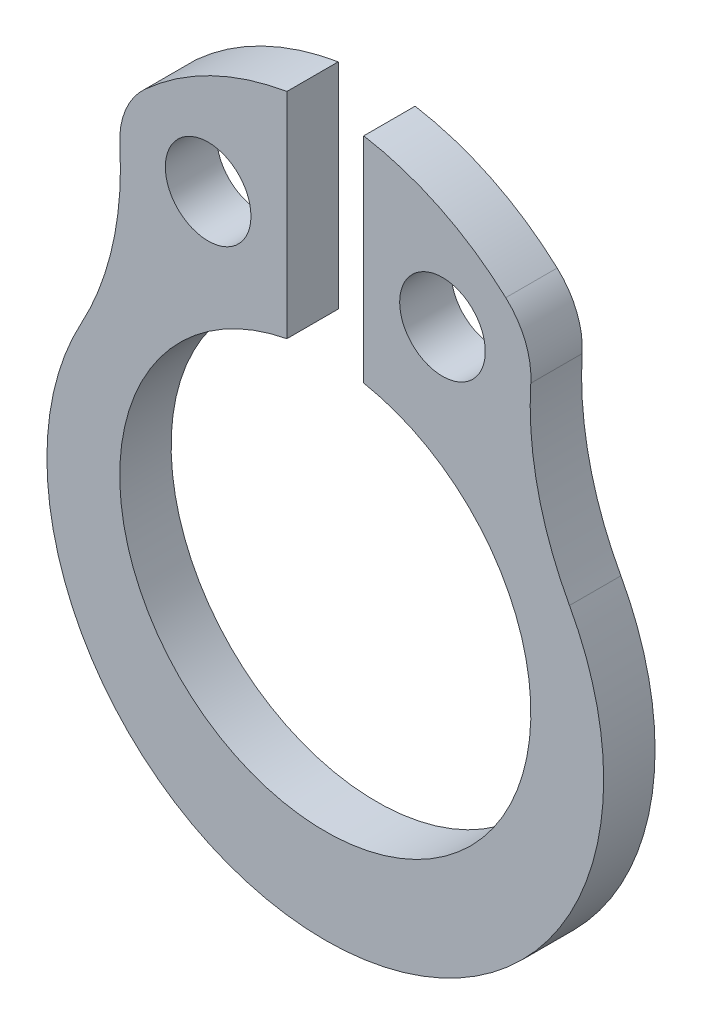
ISO-10303-21;
HEADER;
FILE_DESCRIPTION(('STEP AP214'),'2;1');
FILE_NAME('part.step','',(''),(''),'','','');
FILE_SCHEMA(('AUTOMOTIVE_DESIGN { 1 0 10303 214 1 1 1 1 }'));
ENDSEC;
DATA;
#1=APPLICATION_CONTEXT('core data for automotive mechanical design processes');
#2=APPLICATION_PROTOCOL_DEFINITION('international standard','automotive_design',2000,#1);
#3=PRODUCT_CONTEXT('',#1,'mechanical');
#4=PRODUCT('Part','Part','',(#3));
#5=PRODUCT_RELATED_PRODUCT_CATEGORY('part','',(#4));
#6=PRODUCT_DEFINITION_FORMATION('','',#4);
#7=PRODUCT_DEFINITION_CONTEXT('part definition',#1,'design');
#8=PRODUCT_DEFINITION('design','',#6,#7);
#9=PRODUCT_DEFINITION_SHAPE('','',#8);
#10=(LENGTH_UNIT() NAMED_UNIT(*) SI_UNIT(.MILLI.,.METRE.));
#11=(NAMED_UNIT(*) PLANE_ANGLE_UNIT() SI_UNIT($,.RADIAN.));
#12=(NAMED_UNIT(*) SI_UNIT($,.STERADIAN.) SOLID_ANGLE_UNIT());
#13=UNCERTAINTY_MEASURE_WITH_UNIT(LENGTH_MEASURE(1.E-05),#10,'distance_accuracy_value','');
#14=(GEOMETRIC_REPRESENTATION_CONTEXT(3) GLOBAL_UNCERTAINTY_ASSIGNED_CONTEXT((#13)) GLOBAL_UNIT_ASSIGNED_CONTEXT((#10,
#11,#12)) REPRESENTATION_CONTEXT('',''));
#15=CARTESIAN_POINT('',(0.,0.,0.));
#16=DIRECTION('',(0.,0.,1.));
#17=DIRECTION('',(1.,0.,0.));
#18=AXIS2_PLACEMENT_3D('',#15,#16,#17);
#19=CARTESIAN_POINT('',(-0.0930318965361677,1.63724435281842,0.3));
#20=DIRECTION('',(0.,0.,-1.));
#21=DIRECTION('',(-1.,0.,0.));
#22=AXIS2_PLACEMENT_3D('',#19,#20,#21);
#23=PLANE('',#22);
#24=CARTESIAN_POINT('',(-0.0930318965361677,1.63724435281842,0.3));
#25=DIRECTION('',(0.,0.,1.));
#26=DIRECTION('',(-1.,0.,0.));
#27=AXIS2_PLACEMENT_3D('',#24,#25,#26);
#28=CIRCLE('',#27,3.26568603204113);
#29=CARTESIAN_POINT('',(2.10700125912853,4.05065674481539,0.3));
#30=VERTEX_POINT('',#29);
#31=CARTESIAN_POINT('',(0.448644837297062,4.85769332398569,0.3));
#32=VERTEX_POINT('',#31);
#33=EDGE_CURVE('E163',#30,#32,#28,.T.);
#34=ORIENTED_EDGE('',*,*,#33,.T.);
#35=DIRECTION('',(0.,-1.,0.));
#36=VECTOR('',#35,1.);
#37=CARTESIAN_POINT('',(0.448644837297062,4.85769332398569,0.3));
#38=LINE('',#37,#36);
#39=CARTESIAN_POINT('',(0.448644837297062,2.35769332398569,0.3));
#40=VERTEX_POINT('',#39);
#41=EDGE_CURVE('E101',#32,#40,#38,.T.);
#42=ORIENTED_EDGE('',*,*,#41,.T.);
#43=CARTESIAN_POINT('',(0.,0.,0.3));
#44=DIRECTION('',(0.,0.,-1.));
#45=DIRECTION('',(1.,0.,0.));
#46=AXIS2_PLACEMENT_3D('',#43,#44,#45);
#47=CIRCLE('',#46,2.4);
#48=CARTESIAN_POINT('',(-0.448644837297062,2.35769332398569,0.3));
#49=VERTEX_POINT('',#48);
#50=EDGE_CURVE('E184',#40,#49,#47,.T.);
#51=ORIENTED_EDGE('',*,*,#50,.T.);
#52=DIRECTION('',(0.,1.,0.));
#53=VECTOR('',#52,1.);
#54=CARTESIAN_POINT('',(-0.448644837297062,4.85769332398569,0.3));
#55=LINE('',#54,#53);
#56=CARTESIAN_POINT('',(-0.448644837297062,4.85769332398569,0.3));
#57=VERTEX_POINT('',#56);
#58=EDGE_CURVE('E203',#49,#57,#55,.T.);
#59=ORIENTED_EDGE('',*,*,#58,.T.);
#60=CARTESIAN_POINT('',(0.0930318965361562,1.63724435281842,0.3));
#61=DIRECTION('',(0.,0.,1.));
#62=DIRECTION('',(1.,0.,0.));
#63=AXIS2_PLACEMENT_3D('',#60,#61,#62);
#64=CIRCLE('',#63,3.26568603204113);
#65=CARTESIAN_POINT('',(-2.10700125912855,4.05065674481539,0.3));
#66=VERTEX_POINT('',#65);
#67=EDGE_CURVE('E200',#57,#66,#64,.T.);
#68=ORIENTED_EDGE('',*,*,#67,.T.);
#69=CARTESIAN_POINT('',(-1.50111205714647,3.38600289425138,0.3));
#70=DIRECTION('',(0.,0.,1.));
#71=DIRECTION('',(1.,0.,0.));
#72=AXIS2_PLACEMENT_3D('',#69,#70,#71);
#73=CIRCLE('',#72,0.899370038498089);
#74=CARTESIAN_POINT('',(-2.39882437798507,3.33142217272238,0.3));
#75=VERTEX_POINT('',#74);
#76=EDGE_CURVE('E202',#66,#75,#73,.T.);
#77=ORIENTED_EDGE('',*,*,#76,.T.);
#78=CARTESIAN_POINT('',(-6.12858680478431,3.10465339648909,0.3));
#79=DIRECTION('',(0.,0.,-1.));
#80=DIRECTION('',(-1.,0.,0.));
#81=AXIS2_PLACEMENT_3D('',#78,#79,#80);
#82=CIRCLE('',#81,3.73664981477566);
#83=CARTESIAN_POINT('',(-2.85085236038413,1.31049377419914,0.3));
#84=VERTEX_POINT('',#83);
#85=EDGE_CURVE('E126',#75,#84,#82,.T.);
#86=ORIENTED_EDGE('',*,*,#85,.T.);
#87=CARTESIAN_POINT('',(0.,-0.25,0.3));
#88=DIRECTION('',(0.,0.,1.));
#89=DIRECTION('',(1.,0.,0.));
#90=AXIS2_PLACEMENT_3D('',#87,#88,#89);
#91=CIRCLE('',#90,3.25000000000306);
#92=CARTESIAN_POINT('',(2.85085236038545,1.31049377419605,0.3));
#93=VERTEX_POINT('',#92);
#94=EDGE_CURVE('E120',#84,#93,#91,.T.);
#95=ORIENTED_EDGE('',*,*,#94,.T.);
#96=CARTESIAN_POINT('',(6.12858680478428,3.10465339648909,0.3));
#97=DIRECTION('',(0.,0.,-1.));
#98=DIRECTION('',(1.,0.,0.));
#99=AXIS2_PLACEMENT_3D('',#96,#97,#98);
#100=CIRCLE('',#99,3.73664981477259);
#101=CARTESIAN_POINT('',(2.39882437798473,3.3314221727224,0.3));
#102=VERTEX_POINT('',#101);
#103=EDGE_CURVE('E124',#93,#102,#100,.T.);
#104=ORIENTED_EDGE('',*,*,#103,.T.);
#105=CARTESIAN_POINT('',(1.50111205714645,3.38600289425138,0.3));
#106=DIRECTION('',(0.,0.,1.));
#107=DIRECTION('',(-1.,0.,0.));
#108=AXIS2_PLACEMENT_3D('',#105,#106,#107);
#109=CIRCLE('',#108,0.899370038498088);
#110=EDGE_CURVE('E52',#102,#30,#109,.T.);
#111=ORIENTED_EDGE('',*,*,#110,.T.);
#112=EDGE_LOOP('',(#34,#42,#51,#59,#68,#77,#86,#95,#104,#111));
#113=FACE_BOUND('',#112,.T.);
#114=CARTESIAN_POINT('',(-1.36799975514841,3.38600289425138,0.3));
#115=DIRECTION('',(0.,0.,1.));
#116=DIRECTION('',(1.,0.,0.));
#117=AXIS2_PLACEMENT_3D('',#114,#115,#116);
#118=CIRCLE('',#117,0.5);
#119=CARTESIAN_POINT('',(-0.867999755148409,3.38600289425138,0.3));
#120=VERTEX_POINT('',#119);
#121=EDGE_CURVE('E148',#120,#120,#118,.T.);
#122=ORIENTED_EDGE('',*,*,#121,.F.);
#123=EDGE_LOOP('',(#122));
#124=FACE_BOUND('',#123,.T.);
#125=CARTESIAN_POINT('',(1.36799975515539,3.38600289425138,0.3));
#126=DIRECTION('',(0.,0.,1.));
#127=DIRECTION('',(-1.,0.,0.));
#128=AXIS2_PLACEMENT_3D('',#125,#126,#127);
#129=CIRCLE('',#128,0.5);
#130=CARTESIAN_POINT('',(0.867999755155392,3.38600289425138,0.3));
#131=VERTEX_POINT('',#130);
#132=EDGE_CURVE('E214',#131,#131,#129,.T.);
#133=ORIENTED_EDGE('',*,*,#132,.F.);
#134=EDGE_LOOP('',(#133));
#135=FACE_BOUND('',#134,.T.);
#136=ADVANCED_FACE('F35',(#113,#124,#135),#23,.F.);
#137=CARTESIAN_POINT('',(-0.0930318965361677,1.63724435281842,-0.3));
#138=DIRECTION('',(0.,0.,-1.));
#139=DIRECTION('',(-1.,0.,0.));
#140=AXIS2_PLACEMENT_3D('',#137,#138,#139);
#141=PLANE('',#140);
#142=CARTESIAN_POINT('',(-1.36799975514841,3.38600289425138,-0.3));
#143=DIRECTION('',(0.,0.,1.));
#144=DIRECTION('',(1.,0.,0.));
#145=AXIS2_PLACEMENT_3D('',#142,#143,#144);
#146=CIRCLE('',#145,0.5);
#147=CARTESIAN_POINT('',(-0.867999755148409,3.38600289425138,-0.3));
#148=VERTEX_POINT('',#147);
#149=EDGE_CURVE('E211',#148,#148,#146,.T.);
#150=ORIENTED_EDGE('',*,*,#149,.T.);
#151=EDGE_LOOP('',(#150));
#152=FACE_BOUND('',#151,.T.);
#153=CARTESIAN_POINT('',(-0.0930318965361677,1.63724435281842,-0.3));
#154=DIRECTION('',(0.,0.,1.));
#155=DIRECTION('',(-1.,0.,0.));
#156=AXIS2_PLACEMENT_3D('',#153,#154,#155);
#157=CIRCLE('',#156,3.26568603204113);
#158=CARTESIAN_POINT('',(2.10700125912853,4.05065674481539,-0.3));
#159=VERTEX_POINT('',#158);
#160=CARTESIAN_POINT('',(0.448644837297062,4.85769332398569,-0.3));
#161=VERTEX_POINT('',#160);
#162=EDGE_CURVE('E144',#159,#161,#157,.T.);
#163=ORIENTED_EDGE('',*,*,#162,.F.);
#164=CARTESIAN_POINT('',(1.50111205714645,3.38600289425138,-0.3));
#165=DIRECTION('',(0.,0.,1.));
#166=DIRECTION('',(-1.,0.,0.));
#167=AXIS2_PLACEMENT_3D('',#164,#165,#166);
#168=CIRCLE('',#167,0.899370038498088);
#169=CARTESIAN_POINT('',(2.39882437798473,3.3314221727224,-0.3));
#170=VERTEX_POINT('',#169);
#171=EDGE_CURVE('E93',#170,#159,#168,.T.);
#172=ORIENTED_EDGE('',*,*,#171,.F.);
#173=CARTESIAN_POINT('',(6.12858680478428,3.10465339648909,-0.3));
#174=DIRECTION('',(0.,0.,-1.));
#175=DIRECTION('',(1.,0.,0.));
#176=AXIS2_PLACEMENT_3D('',#173,#174,#175);
#177=CIRCLE('',#176,3.73664981477259);
#178=CARTESIAN_POINT('',(2.85085236038545,1.31049377419605,-0.3));
#179=VERTEX_POINT('',#178);
#180=EDGE_CURVE('E87',#179,#170,#177,.T.);
#181=ORIENTED_EDGE('',*,*,#180,.F.);
#182=CARTESIAN_POINT('',(0.,-0.25,-0.3));
#183=DIRECTION('',(0.,0.,1.));
#184=DIRECTION('',(1.,0.,0.));
#185=AXIS2_PLACEMENT_3D('',#182,#183,#184);
#186=CIRCLE('',#185,3.25000000000306);
#187=CARTESIAN_POINT('',(-2.85085236038413,1.31049377419914,-0.3));
#188=VERTEX_POINT('',#187);
#189=EDGE_CURVE('E134',#188,#179,#186,.T.);
#190=ORIENTED_EDGE('',*,*,#189,.F.);
#191=CARTESIAN_POINT('',(-6.12858680478431,3.10465339648909,-0.3));
#192=DIRECTION('',(0.,0.,-1.));
#193=DIRECTION('',(-1.,0.,0.));
#194=AXIS2_PLACEMENT_3D('',#191,#192,#193);
#195=CIRCLE('',#194,3.73664981477566);
#196=CARTESIAN_POINT('',(-2.39882437798507,3.33142217272238,-0.3));
#197=VERTEX_POINT('',#196);
#198=EDGE_CURVE('E158',#197,#188,#195,.T.);
#199=ORIENTED_EDGE('',*,*,#198,.F.);
#200=CARTESIAN_POINT('',(-1.50111205714647,3.38600289425138,-0.3));
#201=DIRECTION('',(0.,0.,1.));
#202=DIRECTION('',(1.,0.,0.));
#203=AXIS2_PLACEMENT_3D('',#200,#201,#202);
#204=CIRCLE('',#203,0.899370038498089);
#205=CARTESIAN_POINT('',(-2.10700125912855,4.05065674481539,-0.3));
#206=VERTEX_POINT('',#205);
#207=EDGE_CURVE('E156',#206,#197,#204,.T.);
#208=ORIENTED_EDGE('',*,*,#207,.F.);
#209=CARTESIAN_POINT('',(0.0930318965361562,1.63724435281842,-0.3));
#210=DIRECTION('',(0.,0.,1.));
#211=DIRECTION('',(1.,0.,0.));
#212=AXIS2_PLACEMENT_3D('',#209,#210,#211);
#213=CIRCLE('',#212,3.26568603204113);
#214=CARTESIAN_POINT('',(-0.448644837297062,4.85769332398569,-0.3));
#215=VERTEX_POINT('',#214);
#216=EDGE_CURVE('E154',#215,#206,#213,.T.);
#217=ORIENTED_EDGE('',*,*,#216,.F.);
#218=DIRECTION('',(0.,1.,0.));
#219=VECTOR('',#218,1.);
#220=CARTESIAN_POINT('',(-0.448644837297062,4.85769332398569,-0.3));
#221=LINE('',#220,#219);
#222=CARTESIAN_POINT('',(-0.448644837297062,2.35769332398569,-0.3));
#223=VERTEX_POINT('',#222);
#224=EDGE_CURVE('E152',#223,#215,#221,.T.);
#225=ORIENTED_EDGE('',*,*,#224,.F.);
#226=CARTESIAN_POINT('',(0.,0.,-0.3));
#227=DIRECTION('',(0.,0.,-1.));
#228=DIRECTION('',(1.,0.,0.));
#229=AXIS2_PLACEMENT_3D('',#226,#227,#228);
#230=CIRCLE('',#229,2.4);
#231=CARTESIAN_POINT('',(0.448644837297062,2.35769332398569,-0.3));
#232=VERTEX_POINT('',#231);
#233=EDGE_CURVE('E150',#232,#223,#230,.T.);
#234=ORIENTED_EDGE('',*,*,#233,.F.);
#235=DIRECTION('',(0.,-1.,0.));
#236=VECTOR('',#235,1.);
#237=CARTESIAN_POINT('',(0.448644837297062,4.85769332398569,-0.3));
#238=LINE('',#237,#236);
#239=EDGE_CURVE('E147',#161,#232,#238,.T.);
#240=ORIENTED_EDGE('',*,*,#239,.F.);
#241=EDGE_LOOP('',(#163,#172,#181,#190,#199,#208,#217,#225,#234,#240));
#242=FACE_BOUND('',#241,.T.);
#243=CARTESIAN_POINT('',(1.36799975515539,3.38600289425138,-0.3));
#244=DIRECTION('',(0.,0.,1.));
#245=DIRECTION('',(-1.,0.,0.));
#246=AXIS2_PLACEMENT_3D('',#243,#244,#245);
#247=CIRCLE('',#246,0.5);
#248=CARTESIAN_POINT('',(0.867999755155392,3.38600289425138,-0.3));
#249=VERTEX_POINT('',#248);
#250=EDGE_CURVE('E217',#249,#249,#247,.T.);
#251=ORIENTED_EDGE('',*,*,#250,.T.);
#252=EDGE_LOOP('',(#251));
#253=FACE_BOUND('',#252,.T.);
#254=ADVANCED_FACE('F188',(#152,#242,#253),#141,.T.);
#255=CARTESIAN_POINT('',(-0.0930318965361677,1.63724435281842,0.3));
#256=DIRECTION('',(0.,0.,-1.));
#257=DIRECTION('',(-1.,0.,0.));
#258=AXIS2_PLACEMENT_3D('',#255,#256,#257);
#259=CYLINDRICAL_SURFACE('',#258,3.26568603204113);
#260=ORIENTED_EDGE('',*,*,#162,.T.);
#261=DIRECTION('',(0.,0.,-1.));
#262=VECTOR('',#261,1.);
#263=CARTESIAN_POINT('',(0.448644837297062,4.85769332398569,0.3));
#264=LINE('',#263,#262);
#265=EDGE_CURVE('E11',#32,#161,#264,.T.);
#266=ORIENTED_EDGE('',*,*,#265,.F.);
#267=ORIENTED_EDGE('',*,*,#33,.F.);
#268=DIRECTION('',(0.,0.,-1.));
#269=VECTOR('',#268,1.);
#270=CARTESIAN_POINT('',(2.10700125912853,4.05065674481539,0.3));
#271=LINE('',#270,#269);
#272=EDGE_CURVE('E140',#30,#159,#271,.T.);
#273=ORIENTED_EDGE('',*,*,#272,.T.);
#274=EDGE_LOOP('',(#260,#266,#267,#273));
#275=FACE_BOUND('',#274,.T.);
#276=ADVANCED_FACE('F37',(#275),#259,.T.);
#277=CARTESIAN_POINT('',(0.448644837297062,4.85769332398569,0.3));
#278=DIRECTION('',(1.,0.,0.));
#279=DIRECTION('',(0.,1.,0.));
#280=AXIS2_PLACEMENT_3D('',#277,#278,#279);
#281=PLANE('',#280);
#282=ORIENTED_EDGE('',*,*,#239,.T.);
#283=DIRECTION('',(0.,0.,-1.));
#284=VECTOR('',#283,1.);
#285=CARTESIAN_POINT('',(0.448644837297062,2.35769332398569,0.3));
#286=LINE('',#285,#284);
#287=EDGE_CURVE('E44',#40,#232,#286,.T.);
#288=ORIENTED_EDGE('',*,*,#287,.F.);
#289=ORIENTED_EDGE('',*,*,#41,.F.);
#290=ORIENTED_EDGE('',*,*,#265,.T.);
#291=EDGE_LOOP('',(#282,#288,#289,#290));
#292=FACE_BOUND('',#291,.T.);
#293=ADVANCED_FACE('F257',(#292),#281,.F.);
#294=CARTESIAN_POINT('',(0.,0.,0.3));
#295=DIRECTION('',(0.,0.,-1.));
#296=DIRECTION('',(-1.,0.,0.));
#297=AXIS2_PLACEMENT_3D('',#294,#295,#296);
#298=CYLINDRICAL_SURFACE('',#297,2.4);
#299=ORIENTED_EDGE('',*,*,#233,.T.);
#300=DIRECTION('',(0.,0.,-1.));
#301=VECTOR('',#300,1.);
#302=CARTESIAN_POINT('',(-0.448644837297062,2.35769332398569,0.3));
#303=LINE('',#302,#301);
#304=EDGE_CURVE('E176',#49,#223,#303,.T.);
#305=ORIENTED_EDGE('',*,*,#304,.F.);
#306=ORIENTED_EDGE('',*,*,#50,.F.);
#307=ORIENTED_EDGE('',*,*,#287,.T.);
#308=EDGE_LOOP('',(#299,#305,#306,#307));
#309=FACE_BOUND('',#308,.T.);
#310=ADVANCED_FACE('F182',(#309),#298,.F.);
#311=CARTESIAN_POINT('',(-0.448644837297062,4.85769332398569,0.3));
#312=DIRECTION('',(-1.,0.,0.));
#313=DIRECTION('',(0.,-1.,0.));
#314=AXIS2_PLACEMENT_3D('',#311,#312,#313);
#315=PLANE('',#314);
#316=ORIENTED_EDGE('',*,*,#224,.T.);
#317=DIRECTION('',(0.,0.,-1.));
#318=VECTOR('',#317,1.);
#319=CARTESIAN_POINT('',(-0.448644837297062,4.85769332398569,0.3));
#320=LINE('',#319,#318);
#321=EDGE_CURVE('E173',#57,#215,#320,.T.);
#322=ORIENTED_EDGE('',*,*,#321,.F.);
#323=ORIENTED_EDGE('',*,*,#58,.F.);
#324=ORIENTED_EDGE('',*,*,#304,.T.);
#325=EDGE_LOOP('',(#316,#322,#323,#324));
#326=FACE_BOUND('',#325,.T.);
#327=ADVANCED_FACE('F194',(#326),#315,.F.);
#328=CARTESIAN_POINT('',(0.0930318965361562,1.63724435281842,0.3));
#329=DIRECTION('',(0.,0.,-1.));
#330=DIRECTION('',(-1.,0.,0.));
#331=AXIS2_PLACEMENT_3D('',#328,#329,#330);
#332=CYLINDRICAL_SURFACE('',#331,3.26568603204113);
#333=ORIENTED_EDGE('',*,*,#216,.T.);
#334=DIRECTION('',(0.,0.,-1.));
#335=VECTOR('',#334,1.);
#336=CARTESIAN_POINT('',(-2.10700125912855,4.05065674481539,0.3));
#337=LINE('',#336,#335);
#338=EDGE_CURVE('E170',#66,#206,#337,.T.);
#339=ORIENTED_EDGE('',*,*,#338,.F.);
#340=ORIENTED_EDGE('',*,*,#67,.F.);
#341=ORIENTED_EDGE('',*,*,#321,.T.);
#342=EDGE_LOOP('',(#333,#339,#340,#341));
#343=FACE_BOUND('',#342,.T.);
#344=ADVANCED_FACE('F198',(#343),#332,.T.);
#345=CARTESIAN_POINT('',(-1.50111205714647,3.38600289425138,0.3));
#346=DIRECTION('',(0.,0.,-1.));
#347=DIRECTION('',(-1.,0.,0.));
#348=AXIS2_PLACEMENT_3D('',#345,#346,#347);
#349=CYLINDRICAL_SURFACE('',#348,0.899370038498089);
#350=ORIENTED_EDGE('',*,*,#207,.T.);
#351=DIRECTION('',(0.,0.,-1.));
#352=VECTOR('',#351,1.);
#353=CARTESIAN_POINT('',(-2.39882437798507,3.33142217272238,0.3));
#354=LINE('',#353,#352);
#355=EDGE_CURVE('E167',#75,#197,#354,.T.);
#356=ORIENTED_EDGE('',*,*,#355,.F.);
#357=ORIENTED_EDGE('',*,*,#76,.F.);
#358=ORIENTED_EDGE('',*,*,#338,.T.);
#359=EDGE_LOOP('',(#350,#356,#357,#358));
#360=FACE_BOUND('',#359,.T.);
#361=ADVANCED_FACE('F247',(#360),#349,.T.);
#362=CARTESIAN_POINT('',(-6.12858680478431,3.10465339648909,0.3));
#363=DIRECTION('',(0.,0.,-1.));
#364=DIRECTION('',(-1.,0.,0.));
#365=AXIS2_PLACEMENT_3D('',#362,#363,#364);
#366=CYLINDRICAL_SURFACE('',#365,3.73664981477566);
#367=ORIENTED_EDGE('',*,*,#198,.T.);
#368=DIRECTION('',(0.,0.,-1.));
#369=VECTOR('',#368,1.);
#370=CARTESIAN_POINT('',(-2.85085236038413,1.31049377419914,0.3));
#371=LINE('',#370,#369);
#372=EDGE_CURVE('E135',#84,#188,#371,.T.);
#373=ORIENTED_EDGE('',*,*,#372,.F.);
#374=ORIENTED_EDGE('',*,*,#85,.F.);
#375=ORIENTED_EDGE('',*,*,#355,.T.);
#376=EDGE_LOOP('',(#367,#373,#374,#375));
#377=FACE_BOUND('',#376,.T.);
#378=ADVANCED_FACE('F244',(#377),#366,.F.);
#379=CARTESIAN_POINT('',(0.,-0.25,0.3));
#380=DIRECTION('',(0.,0.,-1.));
#381=DIRECTION('',(-1.,0.,0.));
#382=AXIS2_PLACEMENT_3D('',#379,#380,#381);
#383=CYLINDRICAL_SURFACE('',#382,3.25000000000306);
#384=ORIENTED_EDGE('',*,*,#189,.T.);
#385=DIRECTION('',(0.,0.,-1.));
#386=VECTOR('',#385,1.);
#387=CARTESIAN_POINT('',(2.85085236038545,1.31049377419605,0.3));
#388=LINE('',#387,#386);
#389=EDGE_CURVE('E131',#93,#179,#388,.T.);
#390=ORIENTED_EDGE('',*,*,#389,.F.);
#391=ORIENTED_EDGE('',*,*,#94,.F.);
#392=ORIENTED_EDGE('',*,*,#372,.T.);
#393=EDGE_LOOP('',(#384,#390,#391,#392));
#394=FACE_BOUND('',#393,.T.);
#395=ADVANCED_FACE('F132',(#394),#383,.T.);
#396=CARTESIAN_POINT('',(6.12858680478428,3.10465339648909,0.3));
#397=DIRECTION('',(0.,0.,-1.));
#398=DIRECTION('',(-1.,0.,0.));
#399=AXIS2_PLACEMENT_3D('',#396,#397,#398);
#400=CYLINDRICAL_SURFACE('',#399,3.73664981477259);
#401=ORIENTED_EDGE('',*,*,#180,.T.);
#402=DIRECTION('',(0.,0.,-1.));
#403=VECTOR('',#402,1.);
#404=CARTESIAN_POINT('',(2.39882437798473,3.3314221727224,0.3));
#405=LINE('',#404,#403);
#406=EDGE_CURVE('E136',#102,#170,#405,.T.);
#407=ORIENTED_EDGE('',*,*,#406,.F.);
#408=ORIENTED_EDGE('',*,*,#103,.F.);
#409=ORIENTED_EDGE('',*,*,#389,.T.);
#410=EDGE_LOOP('',(#401,#407,#408,#409));
#411=FACE_BOUND('',#410,.T.);
#412=ADVANCED_FACE('F138',(#411),#400,.F.);
#413=CARTESIAN_POINT('',(1.50111205714645,3.38600289425138,0.3));
#414=DIRECTION('',(0.,0.,-1.));
#415=DIRECTION('',(-1.,0.,0.));
#416=AXIS2_PLACEMENT_3D('',#413,#414,#415);
#417=CYLINDRICAL_SURFACE('',#416,0.899370038498088);
#418=ORIENTED_EDGE('',*,*,#171,.T.);
#419=ORIENTED_EDGE('',*,*,#272,.F.);
#420=ORIENTED_EDGE('',*,*,#110,.F.);
#421=ORIENTED_EDGE('',*,*,#406,.T.);
#422=EDGE_LOOP('',(#418,#419,#420,#421));
#423=FACE_BOUND('',#422,.T.);
#424=ADVANCED_FACE('F237',(#423),#417,.T.);
#425=CARTESIAN_POINT('',(-1.36799975514841,3.38600289425138,0.3));
#426=DIRECTION('',(0.,0.,-1.));
#427=DIRECTION('',(-1.,0.,0.));
#428=AXIS2_PLACEMENT_3D('',#425,#426,#427);
#429=CYLINDRICAL_SURFACE('',#428,0.5);
#430=ORIENTED_EDGE('',*,*,#121,.T.);
#431=EDGE_LOOP('',(#430));
#432=FACE_BOUND('',#431,.T.);
#433=ORIENTED_EDGE('',*,*,#149,.F.);
#434=EDGE_LOOP('',(#433));
#435=FACE_BOUND('',#434,.T.);
#436=ADVANCED_FACE('F234',(#432,#435),#429,.F.);
#437=CARTESIAN_POINT('',(1.36799975515539,3.38600289425138,0.3));
#438=DIRECTION('',(0.,0.,-1.));
#439=DIRECTION('',(-1.,0.,0.));
#440=AXIS2_PLACEMENT_3D('',#437,#438,#439);
#441=CYLINDRICAL_SURFACE('',#440,0.5);
#442=ORIENTED_EDGE('',*,*,#132,.T.);
#443=EDGE_LOOP('',(#442));
#444=FACE_BOUND('',#443,.T.);
#445=ORIENTED_EDGE('',*,*,#250,.F.);
#446=EDGE_LOOP('',(#445));
#447=FACE_BOUND('',#446,.T.);
#448=ADVANCED_FACE('F223',(#444,#447),#441,.F.);
#449=CLOSED_SHELL('',(#136,#254,#276,#293,#310,#327,#344,#361,#378,#395,#412,#424,#436,#448));
#450=MANIFOLD_SOLID_BREP('B2',#449);
#451=ADVANCED_BREP_SHAPE_REPRESENTATION('',(#18,#450),#14);
#452=SHAPE_DEFINITION_REPRESENTATION(#9,#451);
ENDSEC;
END-ISO-10303-21;
